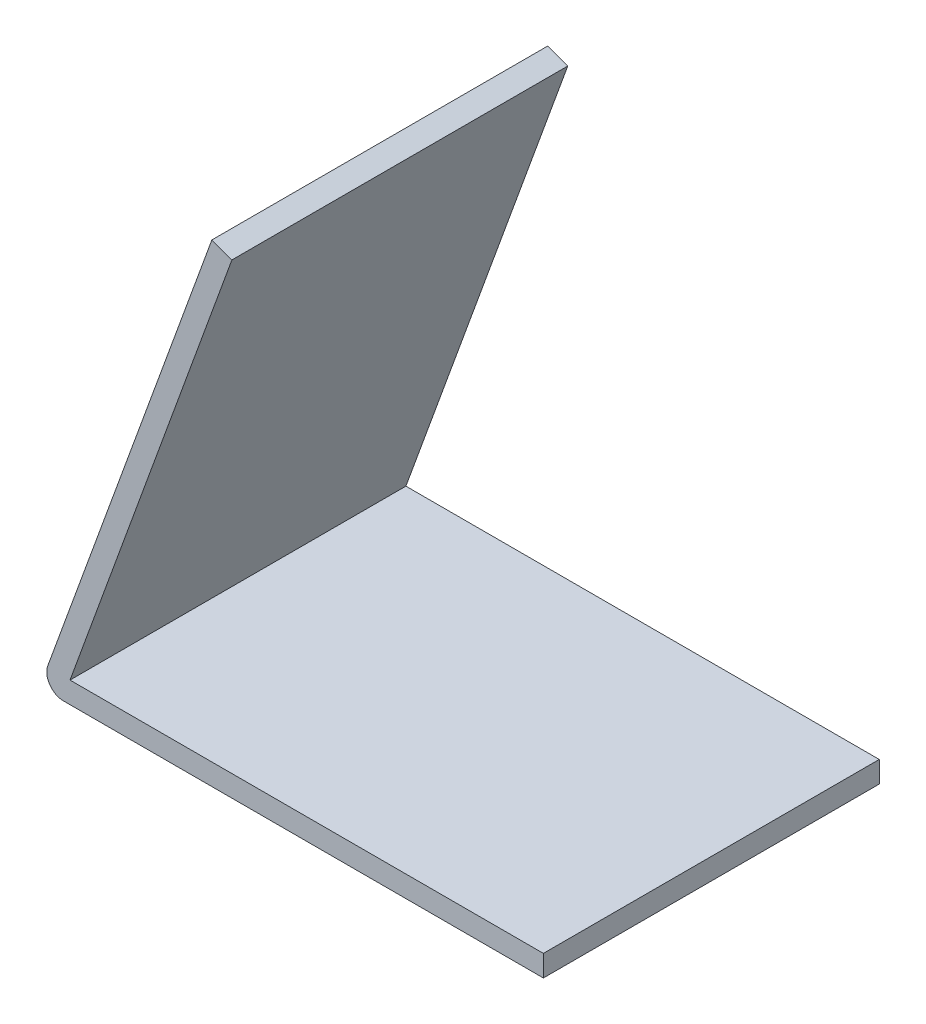
ISO-10303-21;
HEADER;
FILE_DESCRIPTION(('STEP AP214'),'2;1');
FILE_NAME('part.step','',(''),(''),'','','');
FILE_SCHEMA(('AUTOMOTIVE_DESIGN { 1 0 10303 214 1 1 1 1 }'));
ENDSEC;
DATA;
#1=APPLICATION_CONTEXT('core data for automotive mechanical design processes');
#2=APPLICATION_PROTOCOL_DEFINITION('international standard','automotive_design',2000,#1);
#3=PRODUCT_CONTEXT('',#1,'mechanical');
#4=PRODUCT('Part','Part','',(#3));
#5=PRODUCT_RELATED_PRODUCT_CATEGORY('part','',(#4));
#6=PRODUCT_DEFINITION_FORMATION('','',#4);
#7=PRODUCT_DEFINITION_CONTEXT('part definition',#1,'design');
#8=PRODUCT_DEFINITION('design','',#6,#7);
#9=PRODUCT_DEFINITION_SHAPE('','',#8);
#10=(LENGTH_UNIT() NAMED_UNIT(*) SI_UNIT(.MILLI.,.METRE.));
#11=(NAMED_UNIT(*) PLANE_ANGLE_UNIT() SI_UNIT($,.RADIAN.));
#12=(NAMED_UNIT(*) SI_UNIT($,.STERADIAN.) SOLID_ANGLE_UNIT());
#13=UNCERTAINTY_MEASURE_WITH_UNIT(LENGTH_MEASURE(1.E-05),#10,'distance_accuracy_value','');
#14=(GEOMETRIC_REPRESENTATION_CONTEXT(3) GLOBAL_UNCERTAINTY_ASSIGNED_CONTEXT((#13)) GLOBAL_UNIT_ASSIGNED_CONTEXT((#10,
#11,#12)) REPRESENTATION_CONTEXT('',''));
#15=CARTESIAN_POINT('',(0.,0.,0.));
#16=DIRECTION('',(0.,0.,1.));
#17=DIRECTION('',(1.,0.,0.));
#18=AXIS2_PLACEMENT_3D('',#15,#16,#17);
#19=CARTESIAN_POINT('',(0.,0.,50.));
#20=DIRECTION('',(-0.939692620785909,0.342020143325666,0.));
#21=DIRECTION('',(-0.342020143325666,-0.93969262078591,0.));
#22=AXIS2_PLACEMENT_3D('',#19,#20,#21);
#23=PLANE('',#22);
#24=DIRECTION('',(0.342020143325666,0.939692620785909,0.));
#25=VECTOR('',#24,1.);
#26=CARTESIAN_POINT('',(0.,0.,-50.));
#27=LINE('',#26,#25);
#28=CARTESIAN_POINT('',(0.,0.,-50.));
#29=VERTEX_POINT('',#28);
#30=CARTESIAN_POINT('',(48.201329798028,132.432065207768,-50.));
#31=VERTEX_POINT('',#30);
#32=EDGE_CURVE('E127',#29,#31,#27,.T.);
#33=ORIENTED_EDGE('',*,*,#32,.T.);
#34=DIRECTION('',(0.,0.,-1.));
#35=VECTOR('',#34,1.);
#36=CARTESIAN_POINT('',(48.201329798028,132.432065207768,50.));
#37=LINE('',#36,#35);
#38=CARTESIAN_POINT('',(48.201329798028,132.432065207768,50.));
#39=VERTEX_POINT('',#38);
#40=EDGE_CURVE('E107',#39,#31,#37,.T.);
#41=ORIENTED_EDGE('',*,*,#40,.F.);
#42=DIRECTION('',(0.342020143325666,0.939692620785909,0.));
#43=VECTOR('',#42,1.);
#44=CARTESIAN_POINT('',(0.,0.,50.));
#45=LINE('',#44,#43);
#46=CARTESIAN_POINT('',(0.,0.,50.));
#47=VERTEX_POINT('',#46);
#48=EDGE_CURVE('E114',#47,#39,#45,.T.);
#49=ORIENTED_EDGE('',*,*,#48,.F.);
#50=DIRECTION('',(0.,0.,-1.));
#51=VECTOR('',#50,1.);
#52=CARTESIAN_POINT('',(0.,0.,50.));
#53=LINE('',#52,#51);
#54=EDGE_CURVE('E148',#47,#29,#53,.T.);
#55=ORIENTED_EDGE('',*,*,#54,.T.);
#56=EDGE_LOOP('',(#33,#41,#49,#55));
#57=FACE_BOUND('',#56,.T.);
#58=ADVANCED_FACE('F43',(#57),#23,.F.);
#59=CARTESIAN_POINT('',(48.201329798028,132.432065207768,50.));
#60=DIRECTION('',(-0.342020143325666,-0.939692620785909,0.));
#61=DIRECTION('',(0.939692620785909,-0.342020143325666,0.));
#62=AXIS2_PLACEMENT_3D('',#59,#60,#61);
#63=PLANE('',#62);
#64=DIRECTION('',(-0.939692620785909,0.342020143325666,0.));
#65=VECTOR('',#64,1.);
#66=CARTESIAN_POINT('',(48.201329798028,132.432065207768,-50.));
#67=LINE('',#66,#65);
#68=CARTESIAN_POINT('',(42.2342816560375,134.603893117886,-50.));
#69=VERTEX_POINT('',#68);
#70=EDGE_CURVE('E162',#31,#69,#67,.T.);
#71=ORIENTED_EDGE('',*,*,#70,.T.);
#72=DIRECTION('',(0.,0.,-1.));
#73=VECTOR('',#72,1.);
#74=CARTESIAN_POINT('',(42.2342816560375,134.603893117886,50.));
#75=LINE('',#74,#73);
#76=CARTESIAN_POINT('',(42.2342816560375,134.603893117886,50.));
#77=VERTEX_POINT('',#76);
#78=EDGE_CURVE('E110',#77,#69,#75,.T.);
#79=ORIENTED_EDGE('',*,*,#78,.F.);
#80=DIRECTION('',(-0.939692620785909,0.342020143325666,0.));
#81=VECTOR('',#80,1.);
#82=CARTESIAN_POINT('',(48.201329798028,132.432065207768,50.));
#83=LINE('',#82,#81);
#84=EDGE_CURVE('E103',#39,#77,#83,.T.);
#85=ORIENTED_EDGE('',*,*,#84,.F.);
#86=ORIENTED_EDGE('',*,*,#40,.T.);
#87=EDGE_LOOP('',(#71,#79,#85,#86));
#88=FACE_BOUND('',#87,.T.);
#89=ADVANCED_FACE('F105',(#88),#63,.F.);
#90=CARTESIAN_POINT('',(42.2342816560375,134.603893117886,50.));
#91=DIRECTION('',(0.93969262078591,-0.342020143325665,0.));
#92=DIRECTION('',(0.342020143325665,0.93969262078591,0.));
#93=AXIS2_PLACEMENT_3D('',#90,#91,#92);
#94=PLANE('',#93);
#95=DIRECTION('',(-0.342020143325665,-0.93969262078591,0.));
#96=VECTOR('',#95,1.);
#97=CARTESIAN_POINT('',(42.2342816560375,134.603893117886,-50.));
#98=LINE('',#97,#96);
#99=CARTESIAN_POINT('',(-6.62646291303132,0.360100716628342,-50.));
#100=VERTEX_POINT('',#99);
#101=EDGE_CURVE('E159',#69,#100,#98,.T.);
#102=ORIENTED_EDGE('',*,*,#101,.T.);
#103=DIRECTION('',(0.,0.,-1.));
#104=VECTOR('',#103,1.);
#105=CARTESIAN_POINT('',(-6.62646291303134,0.360100716628342,50.));
#106=LINE('',#105,#104);
#107=CARTESIAN_POINT('',(-6.62646291303132,0.360100716628342,50.));
#108=VERTEX_POINT('',#107);
#109=EDGE_CURVE('E52',#100,#108,#106,.F.);
#110=ORIENTED_EDGE('',*,*,#109,.T.);
#111=DIRECTION('',(-0.342020143325665,-0.93969262078591,0.));
#112=VECTOR('',#111,1.);
#113=CARTESIAN_POINT('',(42.2342816560375,134.603893117886,50.));
#114=LINE('',#113,#112);
#115=EDGE_CURVE('E113',#77,#108,#114,.T.);
#116=ORIENTED_EDGE('',*,*,#115,.F.);
#117=ORIENTED_EDGE('',*,*,#78,.T.);
#118=EDGE_LOOP('',(#102,#110,#116,#117));
#119=FACE_BOUND('',#118,.T.);
#120=ADVANCED_FACE('F192',(#119),#94,.F.);
#121=CARTESIAN_POINT('',(-9.06873984281232,-6.35,50.));
#122=DIRECTION('',(0.,1.,0.));
#123=DIRECTION('',(0.,0.,1.));
#124=AXIS2_PLACEMENT_3D('',#121,#122,#123);
#125=PLANE('',#124);
#126=DIRECTION('',(1.,0.,0.));
#127=VECTOR('',#126,1.);
#128=CARTESIAN_POINT('',(-9.06873984281232,-6.35,50.));
#129=LINE('',#128,#127);
#130=CARTESIAN_POINT('',(-1.92799980910179,-6.35,50.));
#131=VERTEX_POINT('',#130);
#132=CARTESIAN_POINT('',(140.931260157188,-6.35,50.));
#133=VERTEX_POINT('',#132);
#134=EDGE_CURVE('E172',#131,#133,#129,.T.);
#135=ORIENTED_EDGE('',*,*,#134,.F.);
#136=DIRECTION('',(0.,0.,-1.));
#137=VECTOR('',#136,1.);
#138=CARTESIAN_POINT('',(-1.92799980910179,-6.35,50.));
#139=LINE('',#138,#137);
#140=CARTESIAN_POINT('',(-1.92799980910179,-6.35,-50.));
#141=VERTEX_POINT('',#140);
#142=EDGE_CURVE('E129',#131,#141,#139,.T.);
#143=ORIENTED_EDGE('',*,*,#142,.T.);
#144=DIRECTION('',(1.,0.,0.));
#145=VECTOR('',#144,1.);
#146=CARTESIAN_POINT('',(-9.06873984281232,-6.35,-50.));
#147=LINE('',#146,#145);
#148=CARTESIAN_POINT('',(140.931260157188,-6.35,-50.));
#149=VERTEX_POINT('',#148);
#150=EDGE_CURVE('E156',#141,#149,#147,.T.);
#151=ORIENTED_EDGE('',*,*,#150,.T.);
#152=DIRECTION('',(0.,0.,-1.));
#153=VECTOR('',#152,1.);
#154=CARTESIAN_POINT('',(140.931260157188,-6.35,50.));
#155=LINE('',#154,#153);
#156=EDGE_CURVE('E135',#133,#149,#155,.T.);
#157=ORIENTED_EDGE('',*,*,#156,.F.);
#158=EDGE_LOOP('',(#135,#143,#151,#157));
#159=FACE_BOUND('',#158,.T.);
#160=ADVANCED_FACE('F181',(#159),#125,.F.);
#161=CARTESIAN_POINT('',(140.931260157188,-6.35,50.));
#162=DIRECTION('',(-1.,0.,0.));
#163=DIRECTION('',(0.,0.,1.));
#164=AXIS2_PLACEMENT_3D('',#161,#162,#163);
#165=PLANE('',#164);
#166=DIRECTION('',(0.,1.,0.));
#167=VECTOR('',#166,1.);
#168=CARTESIAN_POINT('',(140.931260157188,-6.35,-50.));
#169=LINE('',#168,#167);
#170=CARTESIAN_POINT('',(140.931260157188,0.,-50.));
#171=VERTEX_POINT('',#170);
#172=EDGE_CURVE('E153',#149,#171,#169,.T.);
#173=ORIENTED_EDGE('',*,*,#172,.T.);
#174=DIRECTION('',(0.,0.,-1.));
#175=VECTOR('',#174,1.);
#176=CARTESIAN_POINT('',(140.931260157188,0.,50.));
#177=LINE('',#176,#175);
#178=CARTESIAN_POINT('',(140.931260157188,0.,50.));
#179=VERTEX_POINT('',#178);
#180=EDGE_CURVE('E144',#179,#171,#177,.T.);
#181=ORIENTED_EDGE('',*,*,#180,.F.);
#182=DIRECTION('',(0.,1.,0.));
#183=VECTOR('',#182,1.);
#184=CARTESIAN_POINT('',(140.931260157188,-6.35,50.));
#185=LINE('',#184,#183);
#186=EDGE_CURVE('E169',#133,#179,#185,.T.);
#187=ORIENTED_EDGE('',*,*,#186,.F.);
#188=ORIENTED_EDGE('',*,*,#156,.T.);
#189=EDGE_LOOP('',(#173,#181,#187,#188));
#190=FACE_BOUND('',#189,.T.);
#191=ADVANCED_FACE('F188',(#190),#165,.F.);
#192=CARTESIAN_POINT('',(0.,0.,50.));
#193=DIRECTION('',(0.,-1.,0.));
#194=DIRECTION('',(0.,0.,-1.));
#195=AXIS2_PLACEMENT_3D('',#192,#193,#194);
#196=PLANE('',#195);
#197=DIRECTION('',(-1.,0.,0.));
#198=VECTOR('',#197,1.);
#199=CARTESIAN_POINT('',(0.,0.,-50.));
#200=LINE('',#199,#198);
#201=EDGE_CURVE('E124',#171,#29,#200,.T.);
#202=ORIENTED_EDGE('',*,*,#201,.T.);
#203=ORIENTED_EDGE('',*,*,#54,.F.);
#204=DIRECTION('',(-1.,0.,0.));
#205=VECTOR('',#204,1.);
#206=CARTESIAN_POINT('',(0.,0.,50.));
#207=LINE('',#206,#205);
#208=EDGE_CURVE('E119',#179,#47,#207,.T.);
#209=ORIENTED_EDGE('',*,*,#208,.F.);
#210=ORIENTED_EDGE('',*,*,#180,.T.);
#211=EDGE_LOOP('',(#202,#203,#209,#210));
#212=FACE_BOUND('',#211,.T.);
#213=ADVANCED_FACE('F191',(#212),#196,.F.);
#214=CARTESIAN_POINT('',(0.,0.,50.));
#215=DIRECTION('',(0.,0.,1.));
#216=DIRECTION('',(1.,0.,0.));
#217=AXIS2_PLACEMENT_3D('',#214,#215,#216);
#218=PLANE('',#217);
#219=ORIENTED_EDGE('',*,*,#115,.T.);
#220=CARTESIAN_POINT('',(-1.92799980910179,-1.35,50.));
#221=DIRECTION('',(0.,0.,1.));
#222=DIRECTION('',(1.,0.,0.));
#223=AXIS2_PLACEMENT_3D('',#220,#221,#222);
#224=CIRCLE('',#223,5.);
#225=EDGE_CURVE('E11',#108,#131,#224,.T.);
#226=ORIENTED_EDGE('',*,*,#225,.T.);
#227=ORIENTED_EDGE('',*,*,#134,.T.);
#228=ORIENTED_EDGE('',*,*,#186,.T.);
#229=ORIENTED_EDGE('',*,*,#208,.T.);
#230=ORIENTED_EDGE('',*,*,#48,.T.);
#231=ORIENTED_EDGE('',*,*,#84,.T.);
#232=EDGE_LOOP('',(#219,#226,#227,#228,#229,#230,#231));
#233=FACE_BOUND('',#232,.T.);
#234=ADVANCED_FACE('F117',(#233),#218,.T.);
#235=CARTESIAN_POINT('',(0.,0.,-50.));
#236=DIRECTION('',(0.,0.,1.));
#237=DIRECTION('',(1.,0.,0.));
#238=AXIS2_PLACEMENT_3D('',#235,#236,#237);
#239=PLANE('',#238);
#240=ORIENTED_EDGE('',*,*,#150,.F.);
#241=CARTESIAN_POINT('',(-1.92799980910179,-1.35,-50.));
#242=DIRECTION('',(0.,0.,1.));
#243=DIRECTION('',(1.,0.,0.));
#244=AXIS2_PLACEMENT_3D('',#241,#242,#243);
#245=CIRCLE('',#244,5.);
#246=EDGE_CURVE('E66',#141,#100,#245,.F.);
#247=ORIENTED_EDGE('',*,*,#246,.T.);
#248=ORIENTED_EDGE('',*,*,#101,.F.);
#249=ORIENTED_EDGE('',*,*,#70,.F.);
#250=ORIENTED_EDGE('',*,*,#32,.F.);
#251=ORIENTED_EDGE('',*,*,#201,.F.);
#252=ORIENTED_EDGE('',*,*,#172,.F.);
#253=EDGE_LOOP('',(#240,#247,#248,#249,#250,#251,#252));
#254=FACE_BOUND('',#253,.T.);
#255=ADVANCED_FACE('F184',(#254),#239,.F.);
#256=CARTESIAN_POINT('',(-1.92799980910179,-1.35,50.));
#257=DIRECTION('',(0.,0.,-1.));
#258=DIRECTION('',(-1.,0.,0.));
#259=AXIS2_PLACEMENT_3D('',#256,#257,#258);
#260=CYLINDRICAL_SURFACE('',#259,5.);
#261=ORIENTED_EDGE('',*,*,#225,.F.);
#262=ORIENTED_EDGE('',*,*,#109,.F.);
#263=ORIENTED_EDGE('',*,*,#246,.F.);
#264=ORIENTED_EDGE('',*,*,#142,.F.);
#265=EDGE_LOOP('',(#261,#262,#263,#264));
#266=FACE_BOUND('',#265,.T.);
#267=ADVANCED_FACE('F45',(#266),#260,.T.);
#268=CLOSED_SHELL('',(#58,#89,#120,#160,#191,#213,#234,#255,#267));
#269=MANIFOLD_SOLID_BREP('B2',#268);
#270=ADVANCED_BREP_SHAPE_REPRESENTATION('',(#18,#269),#14);
#271=SHAPE_DEFINITION_REPRESENTATION(#9,#270);
ENDSEC;
END-ISO-10303-21;
